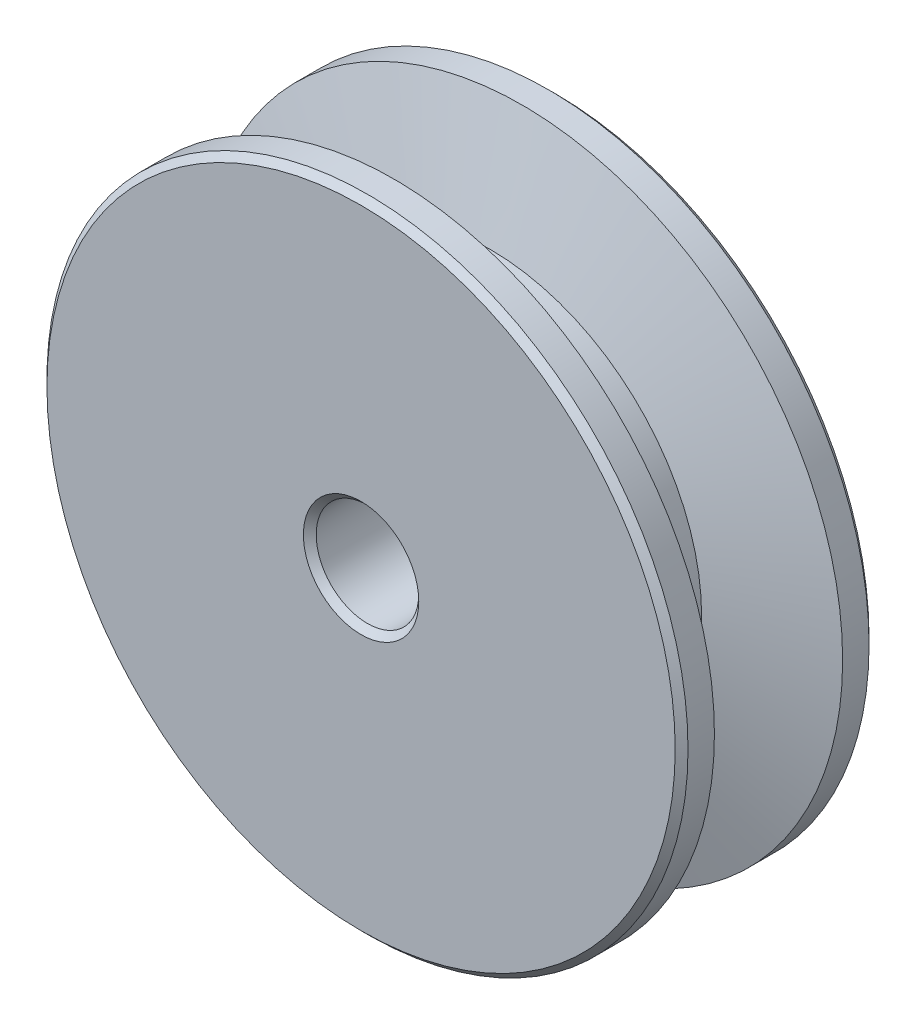
ISO-10303-21;
HEADER;
FILE_DESCRIPTION(('STEP AP214'),'2;1');
FILE_NAME('part.step','',(''),(''),'','','');
FILE_SCHEMA(('AUTOMOTIVE_DESIGN { 1 0 10303 214 1 1 1 1 }'));
ENDSEC;
DATA;
#1=APPLICATION_CONTEXT('core data for automotive mechanical design processes');
#2=APPLICATION_PROTOCOL_DEFINITION('international standard','automotive_design',2000,#1);
#3=PRODUCT_CONTEXT('',#1,'mechanical');
#4=PRODUCT('Part','Part','',(#3));
#5=PRODUCT_RELATED_PRODUCT_CATEGORY('part','',(#4));
#6=PRODUCT_DEFINITION_FORMATION('','',#4);
#7=PRODUCT_DEFINITION_CONTEXT('part definition',#1,'design');
#8=PRODUCT_DEFINITION('design','',#6,#7);
#9=PRODUCT_DEFINITION_SHAPE('','',#8);
#10=(LENGTH_UNIT() NAMED_UNIT(*) SI_UNIT(.MILLI.,.METRE.));
#11=(NAMED_UNIT(*) PLANE_ANGLE_UNIT() SI_UNIT($,.RADIAN.));
#12=(NAMED_UNIT(*) SI_UNIT($,.STERADIAN.) SOLID_ANGLE_UNIT());
#13=UNCERTAINTY_MEASURE_WITH_UNIT(LENGTH_MEASURE(1.E-05),#10,'distance_accuracy_value','');
#14=(GEOMETRIC_REPRESENTATION_CONTEXT(3) GLOBAL_UNCERTAINTY_ASSIGNED_CONTEXT((#13)) GLOBAL_UNIT_ASSIGNED_CONTEXT((#10,
#11,#12)) REPRESENTATION_CONTEXT('',''));
#15=CARTESIAN_POINT('',(0.,0.,0.));
#16=DIRECTION('',(0.,0.,1.));
#17=DIRECTION('',(1.,0.,0.));
#18=AXIS2_PLACEMENT_3D('',#15,#16,#17);
#19=CARTESIAN_POINT('',(0.,0.,-7.56));
#20=DIRECTION('',(0.,0.,1.));
#21=DIRECTION('',(1.,0.,0.));
#22=AXIS2_PLACEMENT_3D('',#19,#20,#21);
#23=CYLINDRICAL_SURFACE('',#22,4.);
#24=CARTESIAN_POINT('',(0.,0.,7.06));
#25=DIRECTION('',(0.,0.,1.));
#26=DIRECTION('',(1.,0.,0.));
#27=AXIS2_PLACEMENT_3D('',#24,#25,#26);
#28=CIRCLE('',#27,4.);
#29=CARTESIAN_POINT('',(4.,0.,7.06));
#30=VERTEX_POINT('',#29);
#31=EDGE_CURVE('E58',#30,#30,#28,.T.);
#32=ORIENTED_EDGE('',*,*,#31,.T.);
#33=EDGE_LOOP('',(#32));
#34=FACE_BOUND('',#33,.T.);
#35=CARTESIAN_POINT('',(0.,0.,-7.05999999999998));
#36=DIRECTION('',(0.,0.,1.));
#37=DIRECTION('',(1.,0.,0.));
#38=AXIS2_PLACEMENT_3D('',#35,#36,#37);
#39=CIRCLE('',#38,4.);
#40=CARTESIAN_POINT('',(4.,0.,-7.05999999999998));
#41=VERTEX_POINT('',#40);
#42=EDGE_CURVE('E61',#41,#41,#39,.F.);
#43=ORIENTED_EDGE('',*,*,#42,.T.);
#44=EDGE_LOOP('',(#43));
#45=FACE_BOUND('',#44,.T.);
#46=CARTESIAN_POINT('',(0.,4.,-2.1));
#47=CARTESIAN_POINT('',(0.109725239522176,3.99999264287857,-2.09999149182402));
#48=CARTESIAN_POINT('',(0.219566121797986,3.99543735627817,-2.09134922217853));
#49=CARTESIAN_POINT('',(0.435956332853303,3.97766056559727,-2.05717948516372));
#50=CARTESIAN_POINT('',(0.542499967026171,3.96442485872988,-2.03162434455593));
#51=CARTESIAN_POINT('',(0.748847767256638,3.93066356262107,-1.96492682041999));
#52=CARTESIAN_POINT('',(0.848677088492021,3.91016722161181,-1.92384693196483));
#53=CARTESIAN_POINT('',(1.0398542926017,3.86372814833453,-1.82761268027));
#54=CARTESIAN_POINT('',(1.13120230734359,3.83778550076629,-1.77245853590725));
#55=CARTESIAN_POINT('',(1.30947182891695,3.78081963010103,-1.64560480379001));
#56=CARTESIAN_POINT('',(1.39572427915895,3.7495762633363,-1.57306544943579));
#57=CARTESIAN_POINT('',(1.55546505007129,3.68618069665244,-1.41532568390628));
#58=CARTESIAN_POINT('',(1.62894256542359,3.65402775386038,-1.33011466668524));
#59=CARTESIAN_POINT('',(1.76753210720387,3.58917602274785,-1.14052416418153));
#60=CARTESIAN_POINT('',(1.83134596949796,3.55667651133238,-1.03511911137417));
#61=CARTESIAN_POINT('',(1.940078009522,3.49855992208216,-0.813221012594949));
#62=CARTESIAN_POINT('',(1.98501055983617,3.47293761465965,-0.696736483534173));
#63=CARTESIAN_POINT('',(2.05162778973323,3.43398312295476,-0.463269101990403));
#64=CARTESIAN_POINT('',(2.07458133375183,3.41998733122416,-0.346765095698015));
#65=CARTESIAN_POINT('',(2.1004206577409,3.40418721984817,-0.110791961344646));
#66=CARTESIAN_POINT('',(2.10333025607272,3.40236843025801,0.00867347806353016));
#67=CARTESIAN_POINT('',(2.08992575686748,3.41060563138389,0.229764140993991));
#68=CARTESIAN_POINT('',(2.07615752002026,3.41908939649749,0.331617646846341));
#69=CARTESIAN_POINT('',(2.03424482005422,3.44418916575293,0.531280148639592));
#70=CARTESIAN_POINT('',(2.00609491145432,3.460808250155,0.629087597405389));
#71=CARTESIAN_POINT('',(1.93576201725035,3.50064017337878,0.820660558664475));
#72=CARTESIAN_POINT('',(1.89327386515967,3.523994639943,0.91428317361142));
#73=CARTESIAN_POINT('',(1.79571666755297,3.57469177714185,1.09353874554009));
#74=CARTESIAN_POINT('',(1.74064200304353,3.60203622704668,1.17916810997697));
#75=CARTESIAN_POINT('',(1.61039398180522,3.66230444404028,1.35278042240983));
#76=CARTESIAN_POINT('',(1.53347842501707,3.69546972830905,1.4393772694657));
#77=CARTESIAN_POINT('',(1.36616462781175,3.76053926987168,1.59905492050666));
#78=CARTESIAN_POINT('',(1.27575868558247,3.79244279356364,1.67212794985428));
#79=CARTESIAN_POINT('',(1.07766804032998,3.85356353260701,1.80658212068465));
#80=CARTESIAN_POINT('',(0.969298919443501,3.88252998474475,1.86707846881169));
#81=CARTESIAN_POINT('',(0.742023442184864,3.93228772595726,1.968462670715));
#82=CARTESIAN_POINT('',(0.623126340783869,3.95308610970455,2.00936754818651));
#83=CARTESIAN_POINT('',(0.389396974626692,3.9825873442618,2.06677267910615));
#84=CARTESIAN_POINT('',(0.275130823094225,3.99219507728301,2.0851069092832));
#85=CARTESIAN_POINT('',(0.0447608666750945,4.00140669767392,2.10269314900914));
#86=CARTESIAN_POINT('',(-0.0713418920738999,4.00101608864393,2.10195565661007));
#87=CARTESIAN_POINT('',(-0.291279078552975,3.99076728683619,2.08237274211712));
#88=CARTESIAN_POINT('',(-0.395299675486033,3.98173859499713,2.06511377045033));
#89=CARTESIAN_POINT('',(-0.598728182196229,3.95626547527309,2.01556124956091));
#90=CARTESIAN_POINT('',(-0.69813560404272,3.93982026491349,1.98326611394665));
#91=CARTESIAN_POINT('',(-0.892553327327725,3.90044221082327,1.90385574618127));
#92=CARTESIAN_POINT('',(-0.987382033379109,3.87735176388228,1.85637692573269));
#93=CARTESIAN_POINT('',(-1.16801156602731,3.82682103032807,1.74838082496518));
#94=CARTESIAN_POINT('',(-1.25380875133066,3.79937900035166,1.687858315483));
#95=CARTESIAN_POINT('',(-1.42355402164766,3.73930849945052,1.54816544610863));
#96=CARTESIAN_POINT('',(-1.50635375236175,3.70643824529688,1.46770186118495));
#97=CARTESIAN_POINT('',(-1.65784945462858,3.64120206418591,1.29414862114276));
#98=CARTESIAN_POINT('',(-1.72653319455466,3.60883659688132,1.20104813104101));
#99=CARTESIAN_POINT('',(-1.85197407713203,3.54618291275876,0.997664409840888));
#100=CARTESIAN_POINT('',(-1.90772058421701,3.51615003477916,0.886671764372897));
#101=CARTESIAN_POINT('',(-1.99916377433976,3.46498558301669,0.654838774035669));
#102=CARTESIAN_POINT('',(-2.03488847416355,3.44384158132139,0.534012462238869));
#103=CARTESIAN_POINT('',(-2.0817922879402,3.41567335738197,0.29850950473885));
#104=CARTESIAN_POINT('',(-2.09503212797939,3.40746939702879,0.184388968767432));
#105=CARTESIAN_POINT('',(-2.10264402498695,3.40278132518373,-0.044693084438132));
#106=CARTESIAN_POINT('',(-2.09702755352026,3.40629008804561,-0.159654047917495));
#107=CARTESIAN_POINT('',(-2.06905731966413,3.42333280060867,-0.373169614322227));
#108=CARTESIAN_POINT('',(-2.04869586578454,3.4356715106149,-0.472094335512849));
#109=CARTESIAN_POINT('',(-1.99445953447469,3.46743607984359,-0.664960814012253));
#110=CARTESIAN_POINT('',(-1.96057985676337,3.48686445637591,-0.758900787812382));
#111=CARTESIAN_POINT('',(-1.87782708009151,3.53215539501753,-0.945996601256967));
#112=CARTESIAN_POINT('',(-1.82811697206111,3.55835615136983,-1.03869769157733));
#113=CARTESIAN_POINT('',(-1.71597189148522,3.61377283019221,-1.21506230921822));
#114=CARTESIAN_POINT('',(-1.65353007488423,3.64299037017672,-1.29872093850826));
#115=CARTESIAN_POINT('',(-1.50756499361578,3.70599460661239,-1.46672364713411));
#116=CARTESIAN_POINT('',(-1.42231898680452,3.73985298438168,-1.54955350976633));
#117=CARTESIAN_POINT('',(-1.2383912708079,3.80472261290781,-1.70015739194561));
#118=CARTESIAN_POINT('',(-1.13970134446326,3.83573210281286,-1.76792213623383));
#119=CARTESIAN_POINT('',(-0.928722586410796,3.89224463430732,-1.88743364904118));
#120=CARTESIAN_POINT('',(-0.816206474636308,3.91762876470985,-1.93884301060636));
#121=CARTESIAN_POINT('',(-0.641101799511682,3.94873745727715,-2.00070791315573));
#122=CARTESIAN_POINT('',(-0.581718321049476,3.95794212176884,-2.01878135698884));
#123=CARTESIAN_POINT('',(-0.461272845180567,3.97377707651405,-2.04965439112677));
#124=CARTESIAN_POINT('',(-0.400211824286291,3.98040883184999,-2.06245698304871));
#125=CARTESIAN_POINT('',(-0.282777177199971,3.99038534961525,-2.08164251076548));
#126=CARTESIAN_POINT('',(-0.226504746010375,3.99398117175069,-2.08851710911178));
#127=CARTESIAN_POINT('',(-0.113498532604899,3.99879042332403,-2.09769809925703));
#128=CARTESIAN_POINT('',(-0.0567647413745312,4.00000380609873,-2.1000044015799));
#129=CARTESIAN_POINT('',(0.,4.,-2.1));
#130=B_SPLINE_CURVE_WITH_KNOTS('',3,(#46,#47,#48,#49,#50,#51,#52,#53,#54,#55,#56,#57,#58,#59,
#60,#61,#62,#63,#64,#65,#66,#67,#68,#69,#70,#71,#72,#73,#74,#75,#76,#77,#78,#79,#80,#81,#82,#83,
#84,#85,#86,#87,#88,#89,#90,#91,#92,#93,#94,#95,#96,#97,#98,#99,#100,#101,#102,#103,#104,#105,
#106,#107,#108,#109,#110,#111,#112,#113,#114,#115,#116,#117,#118,#119,#120,#121,#122,#123,#124,
#125,#126,#127,#128,#129),.UNSPECIFIED.,.T.,.F.,(4,2,2,2,2,2,2,2,2,2,2,2,2,2,2,2,2,2,2,2,2,2,2,
2,2,2,2,2,2,2,2,2,2,2,2,2,2,2,2,2,2,4),(0.,0.328955388056857,0.658450355809533,
0.986632826787797,1.31481019432105,1.66422610127769,2.01393612903032,2.39430542275381,
2.77438464995628,3.13089429519635,3.48698022433372,3.79492330354659,4.10298306894291,
4.41806287071792,4.73328360921357,5.09317488258761,5.4532724136417,5.83355153918037,
6.21349962504739,6.55994297045685,6.90619561978194,7.22222027001752,7.53827827001649,
7.86255611827312,8.18696421086294,8.54557019619715,8.90448561862087,9.28577946390602,
9.66653841880978,10.0100186118085,10.3532898805348,10.6572136356427,10.9612454093544,
11.2851996834104,11.6093285635883,11.9784125341219,12.3477231159961,12.7242211787441,
12.9122308814787,13.1001333688401,13.270310275105,13.4404905144749),.UNSPECIFIED.);
#131=CARTESIAN_POINT('',(0.,4.,-2.1));
#132=VERTEX_POINT('',#131);
#133=EDGE_CURVE('E95',#132,#132,#130,.T.);
#134=ORIENTED_EDGE('',*,*,#133,.F.);
#135=EDGE_LOOP('',(#134));
#136=FACE_BOUND('',#135,.T.);
#137=CARTESIAN_POINT('',(4.,0.,-2.1));
#138=CARTESIAN_POINT('',(3.99999264287857,-0.109725239522176,-2.09999149182402));
#139=CARTESIAN_POINT('',(3.99543735627817,-0.219566121797986,-2.09134922217853));
#140=CARTESIAN_POINT('',(3.97766056559727,-0.435956332853303,-2.05717948516372));
#141=CARTESIAN_POINT('',(3.96442485872988,-0.542499967026171,-2.03162434455593));
#142=CARTESIAN_POINT('',(3.93066356262107,-0.748847767256638,-1.96492682041999));
#143=CARTESIAN_POINT('',(3.91016722161181,-0.848677088492021,-1.92384693196483));
#144=CARTESIAN_POINT('',(3.86372814833453,-1.0398542926017,-1.82761268027));
#145=CARTESIAN_POINT('',(3.83778550076629,-1.13120230734359,-1.77245853590725));
#146=CARTESIAN_POINT('',(3.78081963010103,-1.30947182891695,-1.64560480379001));
#147=CARTESIAN_POINT('',(3.7495762633363,-1.39572427915895,-1.57306544943579));
#148=CARTESIAN_POINT('',(3.68618069665244,-1.55546505007129,-1.41532568390628));
#149=CARTESIAN_POINT('',(3.65402775386038,-1.62894256542359,-1.33011466668524));
#150=CARTESIAN_POINT('',(3.58917602274785,-1.76753210720387,-1.14052416418153));
#151=CARTESIAN_POINT('',(3.55667651133238,-1.83134596949796,-1.03511911137417));
#152=CARTESIAN_POINT('',(3.49855992208216,-1.940078009522,-0.813221012594949));
#153=CARTESIAN_POINT('',(3.47293761465965,-1.98501055983617,-0.696736483534173));
#154=CARTESIAN_POINT('',(3.43398312295476,-2.05162778973323,-0.463269101990403));
#155=CARTESIAN_POINT('',(3.41998733122416,-2.07458133375183,-0.346765095698015));
#156=CARTESIAN_POINT('',(3.40418721984817,-2.1004206577409,-0.110791961344646));
#157=CARTESIAN_POINT('',(3.40236843025801,-2.10333025607272,0.00867347806353016));
#158=CARTESIAN_POINT('',(3.41060563138389,-2.08992575686748,0.229764140993991));
#159=CARTESIAN_POINT('',(3.41908939649749,-2.07615752002026,0.331617646846341));
#160=CARTESIAN_POINT('',(3.44418916575293,-2.03424482005422,0.531280148639592));
#161=CARTESIAN_POINT('',(3.460808250155,-2.00609491145432,0.629087597405389));
#162=CARTESIAN_POINT('',(3.50064017337878,-1.93576201725035,0.820660558664475));
#163=CARTESIAN_POINT('',(3.523994639943,-1.89327386515967,0.91428317361142));
#164=CARTESIAN_POINT('',(3.57469177714185,-1.79571666755297,1.09353874554009));
#165=CARTESIAN_POINT('',(3.60203622704668,-1.74064200304353,1.17916810997697));
#166=CARTESIAN_POINT('',(3.66230444404028,-1.61039398180522,1.35278042240983));
#167=CARTESIAN_POINT('',(3.69546972830905,-1.53347842501707,1.4393772694657));
#168=CARTESIAN_POINT('',(3.76053926987168,-1.36616462781175,1.59905492050666));
#169=CARTESIAN_POINT('',(3.79244279356364,-1.27575868558247,1.67212794985428));
#170=CARTESIAN_POINT('',(3.85356353260701,-1.07766804032998,1.80658212068465));
#171=CARTESIAN_POINT('',(3.88252998474475,-0.969298919443501,1.86707846881169));
#172=CARTESIAN_POINT('',(3.93228772595726,-0.742023442184864,1.968462670715));
#173=CARTESIAN_POINT('',(3.95308610970455,-0.623126340783869,2.00936754818651));
#174=CARTESIAN_POINT('',(3.9825873442618,-0.389396974626692,2.06677267910615));
#175=CARTESIAN_POINT('',(3.99219507728301,-0.275130823094225,2.0851069092832));
#176=CARTESIAN_POINT('',(4.00140669767392,-0.0447608666750945,2.10269314900914));
#177=CARTESIAN_POINT('',(4.00101608864393,0.0713418920738999,2.10195565661007));
#178=CARTESIAN_POINT('',(3.99076728683619,0.291279078552975,2.08237274211712));
#179=CARTESIAN_POINT('',(3.98173859499713,0.395299675486033,2.06511377045033));
#180=CARTESIAN_POINT('',(3.95626547527309,0.598728182196229,2.01556124956091));
#181=CARTESIAN_POINT('',(3.93982026491349,0.69813560404272,1.98326611394665));
#182=CARTESIAN_POINT('',(3.90044221082327,0.892553327327725,1.90385574618127));
#183=CARTESIAN_POINT('',(3.87735176388228,0.987382033379109,1.85637692573269));
#184=CARTESIAN_POINT('',(3.82682103032807,1.16801156602731,1.74838082496518));
#185=CARTESIAN_POINT('',(3.79937900035166,1.25380875133066,1.687858315483));
#186=CARTESIAN_POINT('',(3.73930849945052,1.42355402164766,1.54816544610863));
#187=CARTESIAN_POINT('',(3.70643824529688,1.50635375236175,1.46770186118495));
#188=CARTESIAN_POINT('',(3.64120206418591,1.65784945462858,1.29414862114276));
#189=CARTESIAN_POINT('',(3.60883659688132,1.72653319455466,1.20104813104101));
#190=CARTESIAN_POINT('',(3.54618291275876,1.85197407713203,0.997664409840888));
#191=CARTESIAN_POINT('',(3.51615003477916,1.90772058421701,0.886671764372897));
#192=CARTESIAN_POINT('',(3.46498558301669,1.99916377433976,0.654838774035669));
#193=CARTESIAN_POINT('',(3.44384158132139,2.03488847416355,0.534012462238869));
#194=CARTESIAN_POINT('',(3.41567335738197,2.0817922879402,0.29850950473885));
#195=CARTESIAN_POINT('',(3.40746939702879,2.09503212797939,0.184388968767432));
#196=CARTESIAN_POINT('',(3.40278132518373,2.10264402498695,-0.044693084438132));
#197=CARTESIAN_POINT('',(3.40629008804561,2.09702755352026,-0.159654047917495));
#198=CARTESIAN_POINT('',(3.42333280060867,2.06905731966413,-0.373169614322227));
#199=CARTESIAN_POINT('',(3.4356715106149,2.04869586578454,-0.472094335512849));
#200=CARTESIAN_POINT('',(3.46743607984359,1.99445953447469,-0.664960814012253));
#201=CARTESIAN_POINT('',(3.48686445637591,1.96057985676337,-0.758900787812382));
#202=CARTESIAN_POINT('',(3.53215539501753,1.87782708009151,-0.945996601256967));
#203=CARTESIAN_POINT('',(3.55835615136983,1.82811697206111,-1.03869769157733));
#204=CARTESIAN_POINT('',(3.61377283019221,1.71597189148522,-1.21506230921822));
#205=CARTESIAN_POINT('',(3.64299037017672,1.65353007488423,-1.29872093850826));
#206=CARTESIAN_POINT('',(3.70599460661239,1.50756499361578,-1.46672364713411));
#207=CARTESIAN_POINT('',(3.73985298438168,1.42231898680452,-1.54955350976633));
#208=CARTESIAN_POINT('',(3.80472261290781,1.2383912708079,-1.70015739194561));
#209=CARTESIAN_POINT('',(3.83573210281286,1.13970134446326,-1.76792213623383));
#210=CARTESIAN_POINT('',(3.89224463430732,0.928722586410796,-1.88743364904118));
#211=CARTESIAN_POINT('',(3.91762876470985,0.816206474636308,-1.93884301060636));
#212=CARTESIAN_POINT('',(3.94873745727715,0.641101799511682,-2.00070791315573));
#213=CARTESIAN_POINT('',(3.95794212176884,0.581718321049476,-2.01878135698884));
#214=CARTESIAN_POINT('',(3.97377707651405,0.461272845180567,-2.04965439112677));
#215=CARTESIAN_POINT('',(3.98040883184999,0.400211824286291,-2.06245698304871));
#216=CARTESIAN_POINT('',(3.99038534961525,0.282777177199971,-2.08164251076548));
#217=CARTESIAN_POINT('',(3.99398117175069,0.226504746010375,-2.08851710911178));
#218=CARTESIAN_POINT('',(3.99879042332403,0.113498532604899,-2.09769809925703));
#219=CARTESIAN_POINT('',(4.00000380609873,0.0567647413745312,-2.1000044015799));
#220=CARTESIAN_POINT('',(4.,0.,-2.1));
#221=B_SPLINE_CURVE_WITH_KNOTS('',3,(#137,#138,#139,#140,#141,#142,#143,#144,#145,#146,#147,
#148,#149,#150,#151,#152,#153,#154,#155,#156,#157,#158,#159,#160,#161,#162,#163,#164,#165,#166,
#167,#168,#169,#170,#171,#172,#173,#174,#175,#176,#177,#178,#179,#180,#181,#182,#183,#184,#185,
#186,#187,#188,#189,#190,#191,#192,#193,#194,#195,#196,#197,#198,#199,#200,#201,#202,#203,#204,
#205,#206,#207,#208,#209,#210,#211,#212,#213,#214,#215,#216,#217,#218,#219,#220),.UNSPECIFIED.,
.T.,.F.,(4,2,2,2,2,2,2,2,2,2,2,2,2,2,2,2,2,2,2,2,2,2,2,2,2,2,2,2,2,2,2,2,2,2,2,2,2,2,2,2,2,4),
(0.,0.328955388056857,0.658450355809533,0.986632826787797,1.31481019432105,1.66422610127769,
2.01393612903032,2.39430542275381,2.77438464995628,3.13089429519635,3.48698022433372,
3.79492330354659,4.10298306894291,4.41806287071792,4.73328360921357,5.09317488258761,
5.4532724136417,5.83355153918037,6.21349962504739,6.55994297045685,6.90619561978194,
7.22222027001752,7.53827827001649,7.86255611827312,8.18696421086294,8.54557019619715,
8.90448561862087,9.28577946390602,9.66653841880978,10.0100186118085,10.3532898805348,
10.6572136356427,10.9612454093544,11.2851996834104,11.6093285635883,11.9784125341219,
12.3477231159961,12.7242211787441,12.9122308814787,13.1001333688401,13.270310275105,
13.4404905144749),.UNSPECIFIED.);
#222=CARTESIAN_POINT('',(4.,0.,-2.1));
#223=VERTEX_POINT('',#222);
#224=EDGE_CURVE('E72',#223,#223,#221,.T.);
#225=ORIENTED_EDGE('',*,*,#224,.F.);
#226=EDGE_LOOP('',(#225));
#227=FACE_BOUND('',#226,.T.);
#228=ADVANCED_FACE('F32',(#34,#45,#136,#227),#23,.F.);
#229=CARTESIAN_POINT('',(0.,0.,7.56));
#230=DIRECTION('',(0.,0.,1.));
#231=DIRECTION('',(1.,0.,0.));
#232=AXIS2_PLACEMENT_3D('',#229,#230,#231);
#233=CYLINDRICAL_SURFACE('',#232,16.5);
#234=CARTESIAN_POINT('',(0.,16.5,-2.1));
#235=CARTESIAN_POINT('',(0.117448600764146,16.4999983372099,-2.09999502135526));
#236=CARTESIAN_POINT('',(0.234970156549691,16.4987327488302,-2.09011379426779));
#237=CARTESIAN_POINT('',(0.466741818996083,16.4938058073409,-2.0508523185087));
#238=CARTESIAN_POINT('',(0.580988400378602,16.490141966823,-2.0214518244796));
#239=CARTESIAN_POINT('',(0.802821288130192,16.4808311875705,-1.94403310914624));
#240=CARTESIAN_POINT('',(0.910412066354839,16.4751855977214,-1.89602754914705));
#241=CARTESIAN_POINT('',(1.11599017159712,16.4625388829588,-1.78278937608758));
#242=CARTESIAN_POINT('',(1.21397911574992,16.4555379868982,-1.7175596707685));
#243=CARTESIAN_POINT('',(1.39815050878644,16.4409174329374,-1.57132755319759));
#244=CARTESIAN_POINT('',(1.48427034994256,16.4332948080328,-1.49024657857378));
#245=CARTESIAN_POINT('',(1.64171963274293,16.4183137772833,-1.31478223201503));
#246=CARTESIAN_POINT('',(1.71304831287896,16.4109553850581,-1.22039817560413));
#247=CARTESIAN_POINT('',(1.8391246319816,16.3973067988026,-1.02059881945381));
#248=CARTESIAN_POINT('',(1.89381344704156,16.3910204281315,-0.915146117277212));
#249=CARTESIAN_POINT('',(1.98468193517831,16.3802669067814,-0.696459780642376));
#250=CARTESIAN_POINT('',(2.02086233540485,16.375799684634,-0.583226452063954));
#251=CARTESIAN_POINT('',(2.07349635067789,16.3692186676406,-0.352843717679542));
#252=CARTESIAN_POINT('',(2.09005581327488,16.3670922494956,-0.235718861065244));
#253=CARTESIAN_POINT('',(2.10330545083757,16.3653949969587,-0.000334753040122433));
#254=CARTESIAN_POINT('',(2.09999645317755,16.3658240561501,0.117924450928779));
#255=CARTESIAN_POINT('',(2.07368995612174,16.3691777282626,0.351481802307256));
#256=CARTESIAN_POINT('',(2.0508091597225,16.3720875485268,0.466793337072484));
#257=CARTESIAN_POINT('',(1.98619070224338,16.3800518035177,0.691926695776186));
#258=CARTESIAN_POINT('',(1.94445264630682,16.3851062831518,0.8017484047084));
#259=CARTESIAN_POINT('',(1.84317936308244,16.3968070793643,1.01314659962174));
#260=CARTESIAN_POINT('',(1.78359352922705,16.4034579115305,1.11469858167974));
#261=CARTESIAN_POINT('',(1.64835230221797,16.4175985586601,1.30640608564835));
#262=CARTESIAN_POINT('',(1.57269614722201,16.4250884133909,1.39656106694047));
#263=CARTESIAN_POINT('',(1.40681562197156,16.4401289103442,1.56359269811778));
#264=CARTESIAN_POINT('',(1.31649068081412,16.4476796033463,1.64036950089892));
#265=CARTESIAN_POINT('',(1.12418256094938,16.4619407854189,1.77768756810112));
#266=CARTESIAN_POINT('',(1.02219935365253,16.4686512724288,1.83822879270645));
#267=CARTESIAN_POINT('',(0.809391832478507,16.480480335532,1.94135765662809));
#268=CARTESIAN_POINT('',(0.698564396757348,16.4855983463607,1.98393892278874));
#269=CARTESIAN_POINT('',(0.471252808864835,16.4936607069958,2.04985925084153));
#270=CARTESIAN_POINT('',(0.354768931587822,16.4966051623212,2.07319924684072));
#271=CARTESIAN_POINT('',(0.120314204164005,16.4999749136041,2.09984480742883));
#272=CARTESIAN_POINT('',(0.00235922195702165,16.5004175012202,2.10328789321274));
#273=CARTESIAN_POINT('',(-0.232446108213147,16.4987803681949,2.09040499311015));
#274=CARTESIAN_POINT('',(-0.349296480526642,16.4967007032859,2.07407944403761));
#275=CARTESIAN_POINT('',(-0.578168955572524,16.4902635092393,2.02223695221959));
#276=CARTESIAN_POINT('',(-0.690206176271591,16.4859137788038,1.98678570093426));
#277=CARTESIAN_POINT('',(-0.906745320784605,16.4754233591162,1.89776651471921));
#278=CARTESIAN_POINT('',(-1.01124698006665,16.4692826070294,1.84419794416582));
#279=CARTESIAN_POINT('',(-1.2103619707384,16.4558514716546,1.72013285703141));
#280=CARTESIAN_POINT('',(-1.30491955499193,16.4485551280354,1.64954752695466));
#281=CARTESIAN_POINT('',(-1.48089478852143,16.4336473293964,1.49357805812202));
#282=CARTESIAN_POINT('',(-1.56231189607146,16.4260358614017,1.4081933095499));
#283=CARTESIAN_POINT('',(-1.71018401480537,16.411302198969,1.22444243885263));
#284=CARTESIAN_POINT('',(-1.77654777825637,16.4041831611916,1.12600259567803));
#285=CARTESIAN_POINT('',(-1.89179868515346,16.3912926584878,0.919293036847143));
#286=CARTESIAN_POINT('',(-1.94068618972705,16.3855211657168,0.811023524368043));
#287=CARTESIAN_POINT('',(-2.01944963991704,16.3760008404757,0.588020548143849));
#288=CARTESIAN_POINT('',(-2.04937674394178,16.372246569395,0.473305395388871));
#289=CARTESIAN_POINT('',(-2.08953447010307,16.3671702548398,0.240427021135269));
#290=CARTESIAN_POINT('',(-2.09976604493234,16.3658480937218,0.122263966695839));
#291=CARTESIAN_POINT('',(-2.10022436260484,16.3657892101789,-0.113248071583847));
#292=CARTESIAN_POINT('',(-2.09059446672092,16.3670339596322,-0.230596797549547));
#293=CARTESIAN_POINT('',(-2.05190708691847,16.3719287744196,-0.461993180791067));
#294=CARTESIAN_POINT('',(-2.02284960331692,16.3755788397143,-0.576040838120745));
#295=CARTESIAN_POINT('',(-1.94617721219545,16.3848672217559,-0.797577063275349));
#296=CARTESIAN_POINT('',(-1.89856947467232,16.3905047702258,-0.905068146787476));
#297=CARTESIAN_POINT('',(-1.78616208387823,16.4031341458988,-1.11055913558739));
#298=CARTESIAN_POINT('',(-1.72136218400391,16.4101259925275,-1.20855890470481));
#299=CARTESIAN_POINT('',(-1.57587889510556,16.424736597617,-1.39301791057901));
#300=CARTESIAN_POINT('',(-1.49508870401437,16.4323593591875,-1.47939260143417));
#301=CARTESIAN_POINT('',(-1.32014137379445,16.4473377136487,-1.63741339332646));
#302=CARTESIAN_POINT('',(-1.22598109188771,16.4546932432117,-1.70905602171903));
#303=CARTESIAN_POINT('',(-1.0265398429428,16.4683404798643,-1.83582051912475));
#304=CARTESIAN_POINT('',(-0.921216530124152,16.474627882175,-1.89087619738424));
#305=CARTESIAN_POINT('',(-0.702797238591221,16.4853869750507,-1.98244012426504));
#306=CARTESIAN_POINT('',(-0.589709824110908,16.4898606298157,-2.01896844793121));
#307=CARTESIAN_POINT('',(-0.396702993771542,16.4954145027491,-2.06373497974336));
#308=CARTESIAN_POINT('',(-0.31799868674352,16.4971256492276,-2.07731471527552));
#309=CARTESIAN_POINT('',(-0.1595408039538,16.4994189582772,-2.09544888153017));
#310=CARTESIAN_POINT('',(-0.0797872363265674,16.5000011295956,-2.10000338217996));
#311=CARTESIAN_POINT('',(0.,16.5,-2.1));
#312=B_SPLINE_CURVE_WITH_KNOTS('',3,(#234,#235,#236,#237,#238,#239,#240,#241,#242,#243,#244,
#245,#246,#247,#248,#249,#250,#251,#252,#253,#254,#255,#256,#257,#258,#259,#260,#261,#262,#263,
#264,#265,#266,#267,#268,#269,#270,#271,#272,#273,#274,#275,#276,#277,#278,#279,#280,#281,#282,
#283,#284,#285,#286,#287,#288,#289,#290,#291,#292,#293,#294,#295,#296,#297,#298,#299,#300,#301,
#302,#303,#304,#305,#306,#307,#308,#309,#310,#311),.UNSPECIFIED.,.T.,.F.,(4,2,2,2,2,2,2,2,2,2,2,
2,2,2,2,2,2,2,2,2,2,2,2,2,2,2,2,2,2,2,2,2,2,2,2,2,2,2,4),(0.,0.352054355408512,
0.704474432775326,1.05665509765733,1.40877634616648,1.76268917567942,2.11662022152123,
2.47178829545382,2.82694241464144,3.18017175969457,3.53338639546239,3.88450944379503,
4.23563984471795,4.58777543965129,4.93992773192823,5.29460511805084,5.64928337396734,
6.00408738306251,6.35887416645269,6.7112058145381,7.06352967753492,7.41465103976227,
7.76578472192512,8.11879229445871,8.47181441627666,8.82692241108857,9.18202306756337,
9.5361614747869,9.89028275154586,10.2418569072481,10.5934310572142,10.9448694522204,
11.2963128885106,11.6501881106789,12.0041466530023,12.3594995187269,12.714466520051,
12.9536320912957,13.1927958094841),.UNSPECIFIED.);
#313=CARTESIAN_POINT('',(0.,16.5,-2.1));
#314=VERTEX_POINT('',#313);
#315=EDGE_CURVE('E73',#314,#314,#312,.T.);
#316=ORIENTED_EDGE('',*,*,#315,.T.);
#317=EDGE_LOOP('',(#316));
#318=FACE_BOUND('',#317,.T.);
#319=CARTESIAN_POINT('',(0.,0.,-2.5));
#320=DIRECTION('',(0.,0.,1.));
#321=DIRECTION('',(1.,0.,0.));
#322=AXIS2_PLACEMENT_3D('',#319,#320,#321);
#323=CIRCLE('',#322,16.5);
#324=CARTESIAN_POINT('',(16.5,0.,-2.5));
#325=VERTEX_POINT('',#324);
#326=EDGE_CURVE('E158',#325,#325,#323,.T.);
#327=ORIENTED_EDGE('',*,*,#326,.T.);
#328=EDGE_LOOP('',(#327));
#329=FACE_BOUND('',#328,.T.);
#330=CARTESIAN_POINT('',(0.,0.,2.5));
#331=DIRECTION('',(0.,0.,1.));
#332=DIRECTION('',(1.,0.,0.));
#333=AXIS2_PLACEMENT_3D('',#330,#331,#332);
#334=CIRCLE('',#333,16.5);
#335=CARTESIAN_POINT('',(16.5,0.,2.5));
#336=VERTEX_POINT('',#335);
#337=EDGE_CURVE('E156',#336,#336,#334,.T.);
#338=ORIENTED_EDGE('',*,*,#337,.F.);
#339=EDGE_LOOP('',(#338));
#340=FACE_BOUND('',#339,.T.);
#341=CARTESIAN_POINT('',(16.5,0.,-2.1));
#342=CARTESIAN_POINT('',(16.4999983372099,-0.117448600764146,-2.09999502135526));
#343=CARTESIAN_POINT('',(16.4987327488302,-0.234970156549691,-2.09011379426779));
#344=CARTESIAN_POINT('',(16.4938058073409,-0.466741818996083,-2.0508523185087));
#345=CARTESIAN_POINT('',(16.490141966823,-0.580988400378602,-2.0214518244796));
#346=CARTESIAN_POINT('',(16.4808311875705,-0.802821288130192,-1.94403310914624));
#347=CARTESIAN_POINT('',(16.4751855977214,-0.910412066354839,-1.89602754914705));
#348=CARTESIAN_POINT('',(16.4625388829588,-1.11599017159712,-1.78278937608758));
#349=CARTESIAN_POINT('',(16.4555379868982,-1.21397911574992,-1.7175596707685));
#350=CARTESIAN_POINT('',(16.4409174329374,-1.39815050878644,-1.57132755319759));
#351=CARTESIAN_POINT('',(16.4332948080328,-1.48427034994256,-1.49024657857378));
#352=CARTESIAN_POINT('',(16.4183137772833,-1.64171963274293,-1.31478223201503));
#353=CARTESIAN_POINT('',(16.4109553850581,-1.71304831287896,-1.22039817560413));
#354=CARTESIAN_POINT('',(16.3973067988026,-1.8391246319816,-1.02059881945381));
#355=CARTESIAN_POINT('',(16.3910204281315,-1.89381344704156,-0.915146117277212));
#356=CARTESIAN_POINT('',(16.3802669067814,-1.98468193517831,-0.696459780642376));
#357=CARTESIAN_POINT('',(16.375799684634,-2.02086233540485,-0.583226452063954));
#358=CARTESIAN_POINT('',(16.3692186676406,-2.07349635067789,-0.352843717679542));
#359=CARTESIAN_POINT('',(16.3670922494956,-2.09005581327488,-0.235718861065244));
#360=CARTESIAN_POINT('',(16.3653949969587,-2.10330545083757,-0.000334753040122433));
#361=CARTESIAN_POINT('',(16.3658240561501,-2.09999645317755,0.117924450928779));
#362=CARTESIAN_POINT('',(16.3691777282626,-2.07368995612174,0.351481802307256));
#363=CARTESIAN_POINT('',(16.3720875485268,-2.0508091597225,0.466793337072484));
#364=CARTESIAN_POINT('',(16.3800518035177,-1.98619070224338,0.691926695776186));
#365=CARTESIAN_POINT('',(16.3851062831518,-1.94445264630682,0.8017484047084));
#366=CARTESIAN_POINT('',(16.3968070793643,-1.84317936308244,1.01314659962174));
#367=CARTESIAN_POINT('',(16.4034579115305,-1.78359352922705,1.11469858167974));
#368=CARTESIAN_POINT('',(16.4175985586601,-1.64835230221797,1.30640608564835));
#369=CARTESIAN_POINT('',(16.4250884133909,-1.57269614722201,1.39656106694047));
#370=CARTESIAN_POINT('',(16.4401289103442,-1.40681562197156,1.56359269811778));
#371=CARTESIAN_POINT('',(16.4476796033463,-1.31649068081412,1.64036950089892));
#372=CARTESIAN_POINT('',(16.4619407854189,-1.12418256094938,1.77768756810112));
#373=CARTESIAN_POINT('',(16.4686512724288,-1.02219935365253,1.83822879270645));
#374=CARTESIAN_POINT('',(16.480480335532,-0.809391832478507,1.94135765662809));
#375=CARTESIAN_POINT('',(16.4855983463607,-0.698564396757348,1.98393892278874));
#376=CARTESIAN_POINT('',(16.4936607069958,-0.471252808864835,2.04985925084153));
#377=CARTESIAN_POINT('',(16.4966051623212,-0.354768931587822,2.07319924684072));
#378=CARTESIAN_POINT('',(16.4999749136041,-0.120314204164005,2.09984480742883));
#379=CARTESIAN_POINT('',(16.5004175012202,-0.00235922195702165,2.10328789321274));
#380=CARTESIAN_POINT('',(16.4987803681949,0.232446108213147,2.09040499311015));
#381=CARTESIAN_POINT('',(16.4967007032859,0.349296480526642,2.07407944403761));
#382=CARTESIAN_POINT('',(16.4902635092393,0.578168955572524,2.02223695221959));
#383=CARTESIAN_POINT('',(16.4859137788038,0.690206176271591,1.98678570093426));
#384=CARTESIAN_POINT('',(16.4754233591162,0.906745320784605,1.89776651471921));
#385=CARTESIAN_POINT('',(16.4692826070294,1.01124698006665,1.84419794416582));
#386=CARTESIAN_POINT('',(16.4558514716546,1.2103619707384,1.72013285703141));
#387=CARTESIAN_POINT('',(16.4485551280354,1.30491955499193,1.64954752695466));
#388=CARTESIAN_POINT('',(16.4336473293964,1.48089478852143,1.49357805812202));
#389=CARTESIAN_POINT('',(16.4260358614017,1.56231189607146,1.4081933095499));
#390=CARTESIAN_POINT('',(16.411302198969,1.71018401480537,1.22444243885263));
#391=CARTESIAN_POINT('',(16.4041831611916,1.77654777825637,1.12600259567803));
#392=CARTESIAN_POINT('',(16.3912926584878,1.89179868515346,0.919293036847143));
#393=CARTESIAN_POINT('',(16.3855211657168,1.94068618972705,0.811023524368043));
#394=CARTESIAN_POINT('',(16.3760008404757,2.01944963991704,0.588020548143849));
#395=CARTESIAN_POINT('',(16.372246569395,2.04937674394178,0.473305395388871));
#396=CARTESIAN_POINT('',(16.3671702548398,2.08953447010307,0.240427021135269));
#397=CARTESIAN_POINT('',(16.3658480937218,2.09976604493234,0.122263966695839));
#398=CARTESIAN_POINT('',(16.3657892101789,2.10022436260484,-0.113248071583847));
#399=CARTESIAN_POINT('',(16.3670339596322,2.09059446672092,-0.230596797549547));
#400=CARTESIAN_POINT('',(16.3719287744196,2.05190708691847,-0.461993180791067));
#401=CARTESIAN_POINT('',(16.3755788397143,2.02284960331692,-0.576040838120745));
#402=CARTESIAN_POINT('',(16.3848672217559,1.94617721219545,-0.797577063275349));
#403=CARTESIAN_POINT('',(16.3905047702258,1.89856947467232,-0.905068146787476));
#404=CARTESIAN_POINT('',(16.4031341458988,1.78616208387823,-1.11055913558739));
#405=CARTESIAN_POINT('',(16.4101259925275,1.72136218400391,-1.20855890470481));
#406=CARTESIAN_POINT('',(16.424736597617,1.57587889510556,-1.39301791057901));
#407=CARTESIAN_POINT('',(16.4323593591875,1.49508870401437,-1.47939260143417));
#408=CARTESIAN_POINT('',(16.4473377136487,1.32014137379445,-1.63741339332646));
#409=CARTESIAN_POINT('',(16.4546932432117,1.22598109188771,-1.70905602171903));
#410=CARTESIAN_POINT('',(16.4683404798643,1.0265398429428,-1.83582051912475));
#411=CARTESIAN_POINT('',(16.474627882175,0.921216530124152,-1.89087619738424));
#412=CARTESIAN_POINT('',(16.4853869750507,0.702797238591221,-1.98244012426504));
#413=CARTESIAN_POINT('',(16.4898606298157,0.589709824110908,-2.01896844793121));
#414=CARTESIAN_POINT('',(16.4954145027491,0.396702993771542,-2.06373497974336));
#415=CARTESIAN_POINT('',(16.4971256492276,0.31799868674352,-2.07731471527552));
#416=CARTESIAN_POINT('',(16.4994189582772,0.1595408039538,-2.09544888153017));
#417=CARTESIAN_POINT('',(16.5000011295956,0.0797872363265674,-2.10000338217996));
#418=CARTESIAN_POINT('',(16.5,0.,-2.1));
#419=B_SPLINE_CURVE_WITH_KNOTS('',3,(#341,#342,#343,#344,#345,#346,#347,#348,#349,#350,#351,
#352,#353,#354,#355,#356,#357,#358,#359,#360,#361,#362,#363,#364,#365,#366,#367,#368,#369,#370,
#371,#372,#373,#374,#375,#376,#377,#378,#379,#380,#381,#382,#383,#384,#385,#386,#387,#388,#389,
#390,#391,#392,#393,#394,#395,#396,#397,#398,#399,#400,#401,#402,#403,#404,#405,#406,#407,#408,
#409,#410,#411,#412,#413,#414,#415,#416,#417,#418),.UNSPECIFIED.,.T.,.F.,(4,2,2,2,2,2,2,2,2,2,2,
2,2,2,2,2,2,2,2,2,2,2,2,2,2,2,2,2,2,2,2,2,2,2,2,2,2,2,4),(0.,0.352054355408512,
0.704474432775326,1.05665509765733,1.40877634616648,1.76268917567942,2.11662022152123,
2.47178829545382,2.82694241464144,3.18017175969457,3.53338639546239,3.88450944379503,
4.23563984471795,4.58777543965129,4.93992773192823,5.29460511805084,5.64928337396734,
6.00408738306251,6.35887416645269,6.7112058145381,7.06352967753492,7.41465103976227,
7.76578472192512,8.11879229445871,8.47181441627666,8.82692241108857,9.18202306756337,
9.5361614747869,9.89028275154586,10.2418569072481,10.5934310572142,10.9448694522204,
11.2963128885106,11.6501881106789,12.0041466530023,12.3594995187269,12.714466520051,
12.9536320912957,13.1927958094841),.UNSPECIFIED.);
#420=CARTESIAN_POINT('',(16.5,0.,-2.1));
#421=VERTEX_POINT('',#420);
#422=EDGE_CURVE('E65',#421,#421,#419,.T.);
#423=ORIENTED_EDGE('',*,*,#422,.T.);
#424=EDGE_LOOP('',(#423));
#425=FACE_BOUND('',#424,.T.);
#426=ADVANCED_FACE('F78',(#318,#329,#340,#425),#233,.T.);
#427=CARTESIAN_POINT('',(0.,0.,-7.56));
#428=DIRECTION('',(0.,0.,1.));
#429=DIRECTION('',(1.,0.,0.));
#430=AXIS2_PLACEMENT_3D('',#427,#428,#429);
#431=CYLINDRICAL_SURFACE('',#430,25.);
#432=CARTESIAN_POINT('',(0.,0.,7.05999999999999));
#433=DIRECTION('',(0.,0.,1.));
#434=DIRECTION('',(1.,0.,0.));
#435=AXIS2_PLACEMENT_3D('',#432,#433,#434);
#436=CIRCLE('',#435,25.);
#437=CARTESIAN_POINT('',(25.,0.,7.05999999999999));
#438=VERTEX_POINT('',#437);
#439=EDGE_CURVE('E10',#438,#438,#436,.F.);
#440=ORIENTED_EDGE('',*,*,#439,.T.);
#441=EDGE_LOOP('',(#440));
#442=FACE_BOUND('',#441,.T.);
#443=CARTESIAN_POINT('',(0.,0.,5.));
#444=DIRECTION('',(0.,0.,1.));
#445=DIRECTION('',(1.,0.,0.));
#446=AXIS2_PLACEMENT_3D('',#443,#444,#445);
#447=CIRCLE('',#446,25.);
#448=CARTESIAN_POINT('',(25.,0.,5.));
#449=VERTEX_POINT('',#448);
#450=EDGE_CURVE('E64',#449,#449,#447,.T.);
#451=ORIENTED_EDGE('',*,*,#450,.T.);
#452=EDGE_LOOP('',(#451));
#453=FACE_BOUND('',#452,.T.);
#454=ADVANCED_FACE('F112',(#442,#453),#431,.T.);
#455=CARTESIAN_POINT('',(0.,0.,-7.05999999999999));
#456=DIRECTION('',(0.,0.,1.));
#457=DIRECTION('',(1.,0.,0.));
#458=AXIS2_PLACEMENT_3D('',#455,#456,#457);
#459=CIRCLE('',#458,25.);
#460=CARTESIAN_POINT('',(25.,0.,-7.05999999999999));
#461=VERTEX_POINT('',#460);
#462=EDGE_CURVE('E39',#461,#461,#459,.T.);
#463=ORIENTED_EDGE('',*,*,#462,.T.);
#464=EDGE_LOOP('',(#463));
#465=FACE_BOUND('',#464,.T.);
#466=CARTESIAN_POINT('',(0.,0.,-5.));
#467=DIRECTION('',(0.,0.,1.));
#468=DIRECTION('',(1.,0.,0.));
#469=AXIS2_PLACEMENT_3D('',#466,#467,#468);
#470=CIRCLE('',#469,25.);
#471=CARTESIAN_POINT('',(25.,0.,-5.));
#472=VERTEX_POINT('',#471);
#473=EDGE_CURVE('E174',#472,#472,#470,.T.);
#474=ORIENTED_EDGE('',*,*,#473,.F.);
#475=EDGE_LOOP('',(#474));
#476=FACE_BOUND('',#475,.T.);
#477=ADVANCED_FACE('F110',(#465,#476),#431,.T.);
#478=CARTESIAN_POINT('',(0.,0.,-7.56));
#479=DIRECTION('',(0.,0.,1.));
#480=DIRECTION('',(1.,0.,0.));
#481=AXIS2_PLACEMENT_3D('',#478,#479,#480);
#482=PLANE('',#481);
#483=CARTESIAN_POINT('',(0.,0.,-7.56));
#484=DIRECTION('',(0.,0.,1.));
#485=DIRECTION('',(1.,0.,0.));
#486=AXIS2_PLACEMENT_3D('',#483,#484,#485);
#487=CIRCLE('',#486,4.50000000000002);
#488=CARTESIAN_POINT('',(4.50000000000002,0.,-7.56));
#489=VERTEX_POINT('',#488);
#490=EDGE_CURVE('E43',#489,#489,#487,.T.);
#491=ORIENTED_EDGE('',*,*,#490,.T.);
#492=EDGE_LOOP('',(#491));
#493=FACE_BOUND('',#492,.T.);
#494=CARTESIAN_POINT('',(0.,0.,-7.56));
#495=DIRECTION('',(0.,0.,1.));
#496=DIRECTION('',(1.,0.,0.));
#497=AXIS2_PLACEMENT_3D('',#494,#495,#496);
#498=CIRCLE('',#497,24.5);
#499=CARTESIAN_POINT('',(24.5,0.,-7.56));
#500=VERTEX_POINT('',#499);
#501=EDGE_CURVE('E47',#500,#500,#498,.F.);
#502=ORIENTED_EDGE('',*,*,#501,.T.);
#503=EDGE_LOOP('',(#502));
#504=FACE_BOUND('',#503,.T.);
#505=ADVANCED_FACE('F106',(#493,#504),#482,.F.);
#506=CARTESIAN_POINT('',(0.,0.,7.56));
#507=DIRECTION('',(0.,0.,1.));
#508=DIRECTION('',(1.,0.,0.));
#509=AXIS2_PLACEMENT_3D('',#506,#507,#508);
#510=PLANE('',#509);
#511=CARTESIAN_POINT('',(0.,0.,7.56));
#512=DIRECTION('',(0.,0.,1.));
#513=DIRECTION('',(1.,0.,0.));
#514=AXIS2_PLACEMENT_3D('',#511,#512,#513);
#515=CIRCLE('',#514,4.5);
#516=CARTESIAN_POINT('',(4.5,0.,7.56));
#517=VERTEX_POINT('',#516);
#518=EDGE_CURVE('E52',#517,#517,#515,.F.);
#519=ORIENTED_EDGE('',*,*,#518,.T.);
#520=EDGE_LOOP('',(#519));
#521=FACE_BOUND('',#520,.T.);
#522=CARTESIAN_POINT('',(0.,0.,7.56));
#523=DIRECTION('',(0.,0.,1.));
#524=DIRECTION('',(1.,0.,0.));
#525=AXIS2_PLACEMENT_3D('',#522,#523,#524);
#526=CIRCLE('',#525,24.5);
#527=CARTESIAN_POINT('',(24.5,0.,7.56));
#528=VERTEX_POINT('',#527);
#529=EDGE_CURVE('E55',#528,#528,#526,.T.);
#530=ORIENTED_EDGE('',*,*,#529,.T.);
#531=EDGE_LOOP('',(#530));
#532=FACE_BOUND('',#531,.T.);
#533=ADVANCED_FACE('F104',(#521,#532),#510,.T.);
#534=CARTESIAN_POINT('',(0.,0.,5.));
#535=DIRECTION('',(0.,0.,1.));
#536=DIRECTION('',(1.,0.,0.));
#537=AXIS2_PLACEMENT_3D('',#534,#535,#536);
#538=CONICAL_SURFACE('',#537,25.,1.28474488507758);
#539=ORIENTED_EDGE('',*,*,#337,.T.);
#540=EDGE_LOOP('',(#539));
#541=FACE_BOUND('',#540,.T.);
#542=ORIENTED_EDGE('',*,*,#450,.F.);
#543=EDGE_LOOP('',(#542));
#544=FACE_BOUND('',#543,.T.);
#545=ADVANCED_FACE('F137',(#541,#544),#538,.T.);
#546=CARTESIAN_POINT('',(0.,0.,-2.5));
#547=DIRECTION('',(0.,0.,-1.));
#548=DIRECTION('',(-1.,0.,0.));
#549=AXIS2_PLACEMENT_3D('',#546,#547,#548);
#550=CONICAL_SURFACE('',#549,16.5,1.28474488507758);
#551=ORIENTED_EDGE('',*,*,#473,.T.);
#552=EDGE_LOOP('',(#551));
#553=FACE_BOUND('',#552,.T.);
#554=ORIENTED_EDGE('',*,*,#326,.F.);
#555=EDGE_LOOP('',(#554));
#556=FACE_BOUND('',#555,.T.);
#557=ADVANCED_FACE('F142',(#553,#556),#550,.T.);
#558=CARTESIAN_POINT('',(0.,25.,0.));
#559=DIRECTION('',(0.,-1.,0.));
#560=DIRECTION('',(0.,0.,-1.));
#561=AXIS2_PLACEMENT_3D('',#558,#559,#560);
#562=CYLINDRICAL_SURFACE('',#561,2.1);
#563=ORIENTED_EDGE('',*,*,#315,.F.);
#564=EDGE_LOOP('',(#563));
#565=FACE_BOUND('',#564,.T.);
#566=ORIENTED_EDGE('',*,*,#133,.T.);
#567=EDGE_LOOP('',(#566));
#568=FACE_BOUND('',#567,.T.);
#569=ADVANCED_FACE('F85',(#565,#568),#562,.F.);
#570=CARTESIAN_POINT('',(25.,0.,0.));
#571=DIRECTION('',(-1.,0.,0.));
#572=DIRECTION('',(0.,0.,1.));
#573=AXIS2_PLACEMENT_3D('',#570,#571,#572);
#574=CYLINDRICAL_SURFACE('',#573,2.1);
#575=ORIENTED_EDGE('',*,*,#422,.F.);
#576=EDGE_LOOP('',(#575));
#577=FACE_BOUND('',#576,.T.);
#578=ORIENTED_EDGE('',*,*,#224,.T.);
#579=EDGE_LOOP('',(#578));
#580=FACE_BOUND('',#579,.T.);
#581=ADVANCED_FACE('F81',(#577,#580),#574,.F.);
#582=CARTESIAN_POINT('',(0.,0.,7.06));
#583=DIRECTION('',(0.,0.,1.));
#584=DIRECTION('',(1.,0.,0.));
#585=AXIS2_PLACEMENT_3D('',#582,#583,#584);
#586=CONICAL_SURFACE('',#585,4.,0.785398163397441);
#587=ORIENTED_EDGE('',*,*,#518,.F.);
#588=EDGE_LOOP('',(#587));
#589=FACE_BOUND('',#588,.T.);
#590=ORIENTED_EDGE('',*,*,#31,.F.);
#591=EDGE_LOOP('',(#590));
#592=FACE_BOUND('',#591,.T.);
#593=ADVANCED_FACE('F84',(#589,#592),#586,.F.);
#594=CARTESIAN_POINT('',(0.,0.,-7.56));
#595=DIRECTION('',(0.,0.,-1.));
#596=DIRECTION('',(-1.,0.,0.));
#597=AXIS2_PLACEMENT_3D('',#594,#595,#596);
#598=CONICAL_SURFACE('',#597,4.50000000000002,0.785398163397448);
#599=ORIENTED_EDGE('',*,*,#42,.F.);
#600=EDGE_LOOP('',(#599));
#601=FACE_BOUND('',#600,.T.);
#602=ORIENTED_EDGE('',*,*,#490,.F.);
#603=EDGE_LOOP('',(#602));
#604=FACE_BOUND('',#603,.T.);
#605=ADVANCED_FACE('F117',(#601,#604),#598,.F.);
#606=CARTESIAN_POINT('',(0.,0.,-7.05999999999999));
#607=DIRECTION('',(0.,0.,1.));
#608=DIRECTION('',(1.,0.,0.));
#609=AXIS2_PLACEMENT_3D('',#606,#607,#608);
#610=CONICAL_SURFACE('',#609,25.,0.785398163397445);
#611=ORIENTED_EDGE('',*,*,#501,.F.);
#612=EDGE_LOOP('',(#611));
#613=FACE_BOUND('',#612,.T.);
#614=ORIENTED_EDGE('',*,*,#462,.F.);
#615=EDGE_LOOP('',(#614));
#616=FACE_BOUND('',#615,.T.);
#617=ADVANCED_FACE('F120',(#613,#616),#610,.T.);
#618=CARTESIAN_POINT('',(0.,0.,7.56));
#619=DIRECTION('',(0.,0.,-1.));
#620=DIRECTION('',(-1.,0.,0.));
#621=AXIS2_PLACEMENT_3D('',#618,#619,#620);
#622=CONICAL_SURFACE('',#621,24.5,0.785398163397431);
#623=ORIENTED_EDGE('',*,*,#439,.F.);
#624=EDGE_LOOP('',(#623));
#625=FACE_BOUND('',#624,.T.);
#626=ORIENTED_EDGE('',*,*,#529,.F.);
#627=EDGE_LOOP('',(#626));
#628=FACE_BOUND('',#627,.T.);
#629=ADVANCED_FACE('F34',(#625,#628),#622,.T.);
#630=CLOSED_SHELL('',(#228,#426,#454,#477,#505,#533,#545,#557,#569,#581,#593,#605,#617,#629));
#631=MANIFOLD_SOLID_BREP('B2',#630);
#632=ADVANCED_BREP_SHAPE_REPRESENTATION('',(#18,#631),#14);
#633=SHAPE_DEFINITION_REPRESENTATION(#9,#632);
ENDSEC;
END-ISO-10303-21;
